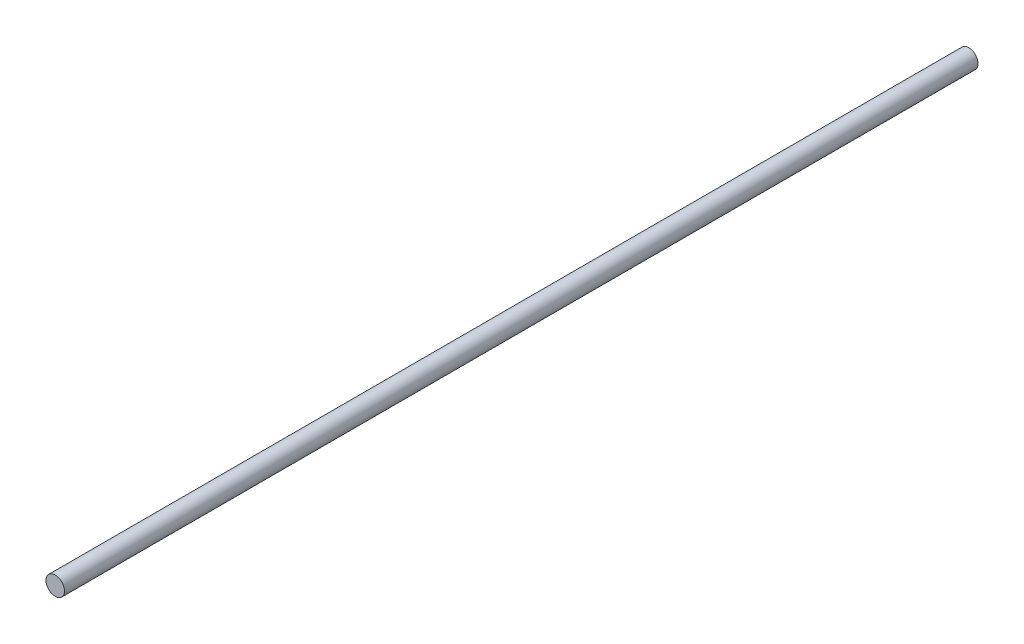
ISO-10303-21;
HEADER;
FILE_DESCRIPTION(('STEP AP214'),'2;1');
FILE_NAME('part.step','',(''),(''),'','','');
FILE_SCHEMA(('AUTOMOTIVE_DESIGN { 1 0 10303 214 1 1 1 1 }'));
ENDSEC;
DATA;
#1=APPLICATION_CONTEXT('core data for automotive mechanical design processes');
#2=APPLICATION_PROTOCOL_DEFINITION('international standard','automotive_design',2000,#1);
#3=PRODUCT_CONTEXT('',#1,'mechanical');
#4=PRODUCT('Part','Part','',(#3));
#5=PRODUCT_RELATED_PRODUCT_CATEGORY('part','',(#4));
#6=PRODUCT_DEFINITION_FORMATION('','',#4);
#7=PRODUCT_DEFINITION_CONTEXT('part definition',#1,'design');
#8=PRODUCT_DEFINITION('design','',#6,#7);
#9=PRODUCT_DEFINITION_SHAPE('','',#8);
#10=(LENGTH_UNIT() NAMED_UNIT(*) SI_UNIT(.MILLI.,.METRE.));
#11=(NAMED_UNIT(*) PLANE_ANGLE_UNIT() SI_UNIT($,.RADIAN.));
#12=(NAMED_UNIT(*) SI_UNIT($,.STERADIAN.) SOLID_ANGLE_UNIT());
#13=UNCERTAINTY_MEASURE_WITH_UNIT(LENGTH_MEASURE(1.E-05),#10,'distance_accuracy_value','');
#14=(GEOMETRIC_REPRESENTATION_CONTEXT(3) GLOBAL_UNCERTAINTY_ASSIGNED_CONTEXT((#13)) GLOBAL_UNIT_ASSIGNED_CONTEXT((#10,
#11,#12)) REPRESENTATION_CONTEXT('',''));
#15=CARTESIAN_POINT('',(0.,0.,0.));
#16=DIRECTION('',(0.,0.,1.));
#17=DIRECTION('',(1.,0.,0.));
#18=AXIS2_PLACEMENT_3D('',#15,#16,#17);
#19=CARTESIAN_POINT('',(0.,0.,394.));
#20=DIRECTION('',(0.,0.,-1.));
#21=DIRECTION('',(-1.,0.,0.));
#22=AXIS2_PLACEMENT_3D('',#19,#20,#21);
#23=CYLINDRICAL_SURFACE('',#22,4.);
#24=CARTESIAN_POINT('',(0.,0.,394.));
#25=DIRECTION('',(0.,0.,1.));
#26=DIRECTION('',(1.,0.,0.));
#27=AXIS2_PLACEMENT_3D('',#24,#25,#26);
#28=CIRCLE('',#27,4.);
#29=CARTESIAN_POINT('',(4.,0.,394.));
#30=VERTEX_POINT('',#29);
#31=EDGE_CURVE('E10',#30,#30,#28,.T.);
#32=ORIENTED_EDGE('',*,*,#31,.F.);
#33=EDGE_LOOP('',(#32));
#34=FACE_BOUND('',#33,.T.);
#35=CARTESIAN_POINT('',(0.,0.,0.));
#36=DIRECTION('',(0.,0.,1.));
#37=DIRECTION('',(1.,0.,0.));
#38=AXIS2_PLACEMENT_3D('',#35,#36,#37);
#39=CIRCLE('',#38,4.);
#40=CARTESIAN_POINT('',(4.,0.,0.));
#41=VERTEX_POINT('',#40);
#42=EDGE_CURVE('E46',#41,#41,#39,.T.);
#43=ORIENTED_EDGE('',*,*,#42,.T.);
#44=EDGE_LOOP('',(#43));
#45=FACE_BOUND('',#44,.T.);
#46=ADVANCED_FACE('F43',(#34,#45),#23,.T.);
#47=CARTESIAN_POINT('',(0.,0.,394.));
#48=DIRECTION('',(0.,0.,1.));
#49=DIRECTION('',(1.,0.,0.));
#50=AXIS2_PLACEMENT_3D('',#47,#48,#49);
#51=PLANE('',#50);
#52=ORIENTED_EDGE('',*,*,#31,.T.);
#53=EDGE_LOOP('',(#52));
#54=FACE_BOUND('',#53,.T.);
#55=ADVANCED_FACE('F60',(#54),#51,.T.);
#56=CARTESIAN_POINT('',(0.,0.,0.));
#57=DIRECTION('',(0.,0.,1.));
#58=DIRECTION('',(1.,0.,0.));
#59=AXIS2_PLACEMENT_3D('',#56,#57,#58);
#60=PLANE('',#59);
#61=ORIENTED_EDGE('',*,*,#42,.F.);
#62=EDGE_LOOP('',(#61));
#63=FACE_BOUND('',#62,.T.);
#64=ADVANCED_FACE('F58',(#63),#60,.F.);
#65=CLOSED_SHELL('',(#46,#55,#64));
#66=MANIFOLD_SOLID_BREP('B2',#65);
#67=ADVANCED_BREP_SHAPE_REPRESENTATION('',(#18,#66),#14);
#68=SHAPE_DEFINITION_REPRESENTATION(#9,#67);
ENDSEC;
END-ISO-10303-21;
